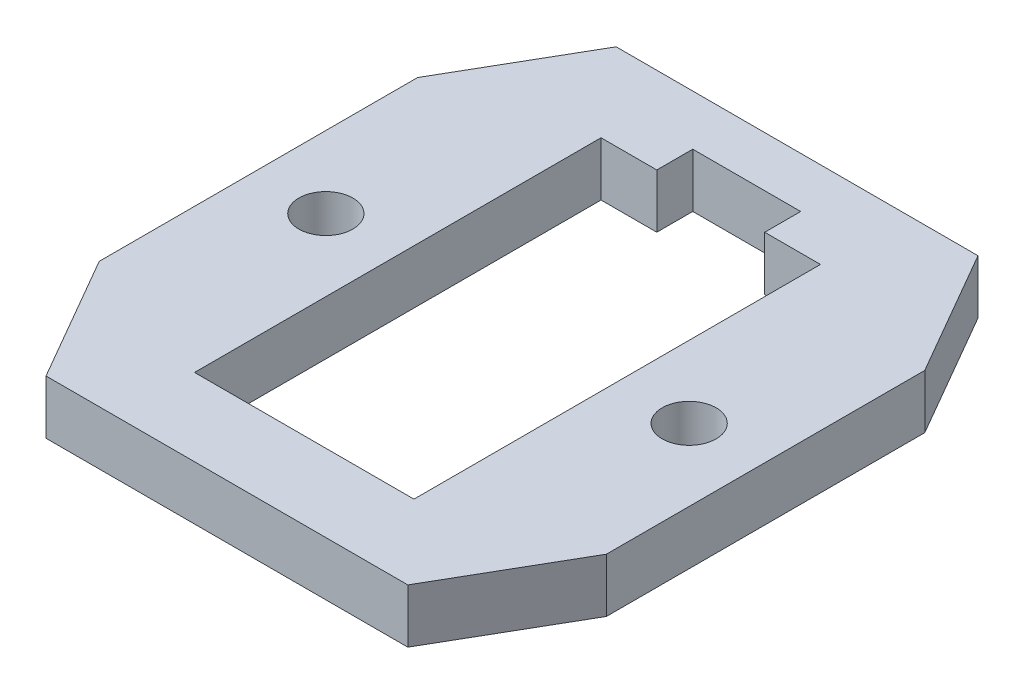
ISO-10303-21;
HEADER;
FILE_DESCRIPTION(('STEP AP214'),'2;1');
FILE_NAME('part.step','',(''),(''),'','','');
FILE_SCHEMA(('AUTOMOTIVE_DESIGN { 1 0 10303 214 1 1 1 1 }'));
ENDSEC;
DATA;
#1=APPLICATION_CONTEXT('core data for automotive mechanical design processes');
#2=APPLICATION_PROTOCOL_DEFINITION('international standard','automotive_design',2000,#1);
#3=PRODUCT_CONTEXT('',#1,'mechanical');
#4=PRODUCT('Part','Part','',(#3));
#5=PRODUCT_RELATED_PRODUCT_CATEGORY('part','',(#4));
#6=PRODUCT_DEFINITION_FORMATION('','',#4);
#7=PRODUCT_DEFINITION_CONTEXT('part definition',#1,'design');
#8=PRODUCT_DEFINITION('design','',#6,#7);
#9=PRODUCT_DEFINITION_SHAPE('','',#8);
#10=(LENGTH_UNIT() NAMED_UNIT(*) SI_UNIT(.MILLI.,.METRE.));
#11=(NAMED_UNIT(*) PLANE_ANGLE_UNIT() SI_UNIT($,.RADIAN.));
#12=(NAMED_UNIT(*) SI_UNIT($,.STERADIAN.) SOLID_ANGLE_UNIT());
#13=UNCERTAINTY_MEASURE_WITH_UNIT(LENGTH_MEASURE(1.E-05),#10,'distance_accuracy_value','');
#14=(GEOMETRIC_REPRESENTATION_CONTEXT(3) GLOBAL_UNCERTAINTY_ASSIGNED_CONTEXT((#13)) GLOBAL_UNIT_ASSIGNED_CONTEXT((#10,
#11,#12)) REPRESENTATION_CONTEXT('',''));
#15=CARTESIAN_POINT('',(0.,0.,0.));
#16=DIRECTION('',(0.,0.,1.));
#17=DIRECTION('',(1.,0.,0.));
#18=AXIS2_PLACEMENT_3D('',#15,#16,#17);
#19=CARTESIAN_POINT('',(0.,3.,0.));
#20=DIRECTION('',(0.,-1.,0.));
#21=DIRECTION('',(0.,0.,-1.));
#22=AXIS2_PLACEMENT_3D('',#19,#20,#21);
#23=PLANE('',#22);
#24=CARTESIAN_POINT('',(-10.1,3.,0.));
#25=DIRECTION('',(0.,1.,0.));
#26=DIRECTION('',(0.,0.,-1.));
#27=AXIS2_PLACEMENT_3D('',#24,#25,#26);
#28=CIRCLE('',#27,1.5);
#29=CARTESIAN_POINT('',(-10.1,3.,-1.5));
#30=VERTEX_POINT('',#29);
#31=EDGE_CURVE('E337',#30,#30,#28,.T.);
#32=ORIENTED_EDGE('',*,*,#31,.F.);
#33=EDGE_LOOP('',(#32));
#34=FACE_BOUND('',#33,.T.);
#35=CARTESIAN_POINT('',(10.1,3.,0.));
#36=DIRECTION('',(0.,1.,0.));
#37=DIRECTION('',(0.,0.,1.));
#38=AXIS2_PLACEMENT_3D('',#35,#36,#37);
#39=CIRCLE('',#38,1.5);
#40=CARTESIAN_POINT('',(10.1,3.,1.5));
#41=VERTEX_POINT('',#40);
#42=EDGE_CURVE('E206',#41,#41,#39,.T.);
#43=ORIENTED_EDGE('',*,*,#42,.F.);
#44=EDGE_LOOP('',(#43));
#45=FACE_BOUND('',#44,.T.);
#46=DIRECTION('',(-1.,0.,0.));
#47=VECTOR('',#46,1.);
#48=CARTESIAN_POINT('',(3.,3.,-11.3));
#49=LINE('',#48,#47);
#50=CARTESIAN_POINT('',(6.1,3.,-11.3));
#51=VERTEX_POINT('',#50);
#52=CARTESIAN_POINT('',(3.,3.,-11.3));
#53=VERTEX_POINT('',#52);
#54=EDGE_CURVE('E155',#51,#53,#49,.T.);
#55=ORIENTED_EDGE('',*,*,#54,.F.);
#56=DIRECTION('',(0.,0.,-1.));
#57=VECTOR('',#56,1.);
#58=CARTESIAN_POINT('',(6.1,3.,11.3));
#59=LINE('',#58,#57);
#60=CARTESIAN_POINT('',(6.1,3.,11.3));
#61=VERTEX_POINT('',#60);
#62=EDGE_CURVE('E200',#61,#51,#59,.T.);
#63=ORIENTED_EDGE('',*,*,#62,.F.);
#64=DIRECTION('',(1.,0.,0.));
#65=VECTOR('',#64,1.);
#66=CARTESIAN_POINT('',(-6.1,3.,11.3));
#67=LINE('',#66,#65);
#68=CARTESIAN_POINT('',(-6.1,3.,11.3));
#69=VERTEX_POINT('',#68);
#70=EDGE_CURVE('E196',#69,#61,#67,.T.);
#71=ORIENTED_EDGE('',*,*,#70,.F.);
#72=DIRECTION('',(0.,0.,1.));
#73=VECTOR('',#72,1.);
#74=CARTESIAN_POINT('',(-6.1,3.,11.3));
#75=LINE('',#74,#73);
#76=CARTESIAN_POINT('',(-6.1,3.,-11.3));
#77=VERTEX_POINT('',#76);
#78=EDGE_CURVE('E193',#77,#69,#75,.T.);
#79=ORIENTED_EDGE('',*,*,#78,.F.);
#80=DIRECTION('',(-1.,0.,0.));
#81=VECTOR('',#80,1.);
#82=CARTESIAN_POINT('',(-6.1,3.,-11.3));
#83=LINE('',#82,#81);
#84=CARTESIAN_POINT('',(-3.,3.,-11.3));
#85=VERTEX_POINT('',#84);
#86=EDGE_CURVE('E190',#85,#77,#83,.T.);
#87=ORIENTED_EDGE('',*,*,#86,.F.);
#88=DIRECTION('',(0.,0.,1.));
#89=VECTOR('',#88,1.);
#90=CARTESIAN_POINT('',(-3.,3.,-11.3));
#91=LINE('',#90,#89);
#92=CARTESIAN_POINT('',(-3.,3.,-13.3));
#93=VERTEX_POINT('',#92);
#94=EDGE_CURVE('E184',#93,#85,#91,.T.);
#95=ORIENTED_EDGE('',*,*,#94,.F.);
#96=DIRECTION('',(-1.,0.,0.));
#97=VECTOR('',#96,1.);
#98=CARTESIAN_POINT('',(-3.,3.,-13.3));
#99=LINE('',#98,#97);
#100=CARTESIAN_POINT('',(3.,3.,-13.3));
#101=VERTEX_POINT('',#100);
#102=EDGE_CURVE('E180',#101,#93,#99,.T.);
#103=ORIENTED_EDGE('',*,*,#102,.F.);
#104=DIRECTION('',(0.,0.,-1.));
#105=VECTOR('',#104,1.);
#106=CARTESIAN_POINT('',(3.,3.,-11.3));
#107=LINE('',#106,#105);
#108=EDGE_CURVE('E166',#53,#101,#107,.T.);
#109=ORIENTED_EDGE('',*,*,#108,.F.);
#110=EDGE_LOOP('',(#55,#63,#71,#79,#87,#95,#103,#109));
#111=FACE_BOUND('',#110,.T.);
#112=DIRECTION('',(-1.,0.,0.));
#113=VECTOR('',#112,1.);
#114=CARTESIAN_POINT('',(14.1,3.,15.6));
#115=LINE('',#114,#113);
#116=CARTESIAN_POINT('',(10.0585481156726,3.,15.6));
#117=VERTEX_POINT('',#116);
#118=CARTESIAN_POINT('',(-10.0585481156726,3.,15.6));
#119=VERTEX_POINT('',#118);
#120=EDGE_CURVE('E324',#117,#119,#115,.T.);
#121=ORIENTED_EDGE('',*,*,#120,.F.);
#122=DIRECTION('',(0.499999999999998,0.,-0.86602540378444));
#123=VECTOR('',#122,1.);
#124=CARTESIAN_POINT('',(10.0585481156726,3.,15.6));
#125=LINE('',#124,#123);
#126=CARTESIAN_POINT('',(14.1,3.,8.59999999999997));
#127=VERTEX_POINT('',#126);
#128=EDGE_CURVE('E65',#117,#127,#125,.T.);
#129=ORIENTED_EDGE('',*,*,#128,.T.);
#130=DIRECTION('',(0.,0.,-1.));
#131=VECTOR('',#130,1.);
#132=CARTESIAN_POINT('',(14.1,3.,16.1));
#133=LINE('',#132,#131);
#134=CARTESIAN_POINT('',(14.1,3.,-9.09999999999997));
#135=VERTEX_POINT('',#134);
#136=EDGE_CURVE('E251',#127,#135,#133,.T.);
#137=ORIENTED_EDGE('',*,*,#136,.T.);
#138=DIRECTION('',(0.499999999999999,0.,0.86602540378444));
#139=VECTOR('',#138,1.);
#140=CARTESIAN_POINT('',(10.0585481156726,3.,-16.1));
#141=LINE('',#140,#139);
#142=CARTESIAN_POINT('',(10.0585481156726,3.,-16.1));
#143=VERTEX_POINT('',#142);
#144=EDGE_CURVE('E284',#135,#143,#141,.F.);
#145=ORIENTED_EDGE('',*,*,#144,.T.);
#146=DIRECTION('',(-1.,0.,0.));
#147=VECTOR('',#146,1.);
#148=CARTESIAN_POINT('',(-14.1,3.,-16.1));
#149=LINE('',#148,#147);
#150=CARTESIAN_POINT('',(-10.0585481156726,3.,-16.1));
#151=VERTEX_POINT('',#150);
#152=EDGE_CURVE('E254',#143,#151,#149,.T.);
#153=ORIENTED_EDGE('',*,*,#152,.T.);
#154=DIRECTION('',(0.499999999999998,0.,-0.86602540378444));
#155=VECTOR('',#154,1.);
#156=CARTESIAN_POINT('',(-14.1,3.,-9.09999999999997));
#157=LINE('',#156,#155);
#158=CARTESIAN_POINT('',(-14.1,3.,-9.09999999999997));
#159=VERTEX_POINT('',#158);
#160=EDGE_CURVE('E297',#151,#159,#157,.F.);
#161=ORIENTED_EDGE('',*,*,#160,.T.);
#162=DIRECTION('',(0.,0.,1.));
#163=VECTOR('',#162,1.);
#164=CARTESIAN_POINT('',(-14.1,3.,16.1));
#165=LINE('',#164,#163);
#166=CARTESIAN_POINT('',(-14.1,3.,8.59999999999997));
#167=VERTEX_POINT('',#166);
#168=EDGE_CURVE('E259',#159,#167,#165,.T.);
#169=ORIENTED_EDGE('',*,*,#168,.T.);
#170=DIRECTION('',(0.499999999999999,0.,0.86602540378444));
#171=VECTOR('',#170,1.);
#172=CARTESIAN_POINT('',(-10.0585481156726,3.,15.6));
#173=LINE('',#172,#171);
#174=EDGE_CURVE('E310',#167,#119,#173,.T.);
#175=ORIENTED_EDGE('',*,*,#174,.T.);
#176=EDGE_LOOP('',(#121,#129,#137,#145,#153,#161,#169,#175));
#177=FACE_BOUND('',#176,.T.);
#178=ADVANCED_FACE('F41',(#34,#45,#111,#177),#23,.F.);
#179=CARTESIAN_POINT('',(0.,0.,0.));
#180=DIRECTION('',(0.,-1.,0.));
#181=DIRECTION('',(0.,0.,-1.));
#182=AXIS2_PLACEMENT_3D('',#179,#180,#181);
#183=PLANE('',#182);
#184=CARTESIAN_POINT('',(10.1,0.,0.));
#185=DIRECTION('',(0.,1.,0.));
#186=DIRECTION('',(0.,0.,1.));
#187=AXIS2_PLACEMENT_3D('',#184,#185,#186);
#188=CIRCLE('',#187,1.5);
#189=CARTESIAN_POINT('',(10.1,0.,1.5));
#190=VERTEX_POINT('',#189);
#191=EDGE_CURVE('E343',#190,#190,#188,.T.);
#192=ORIENTED_EDGE('',*,*,#191,.T.);
#193=EDGE_LOOP('',(#192));
#194=FACE_BOUND('',#193,.T.);
#195=DIRECTION('',(0.,0.,-1.));
#196=VECTOR('',#195,1.);
#197=CARTESIAN_POINT('',(6.1,0.,11.3));
#198=LINE('',#197,#196);
#199=CARTESIAN_POINT('',(6.1,0.,11.3));
#200=VERTEX_POINT('',#199);
#201=CARTESIAN_POINT('',(6.1,0.,-11.3));
#202=VERTEX_POINT('',#201);
#203=EDGE_CURVE('E167',#200,#202,#198,.T.);
#204=ORIENTED_EDGE('',*,*,#203,.T.);
#205=DIRECTION('',(-1.,0.,0.));
#206=VECTOR('',#205,1.);
#207=CARTESIAN_POINT('',(3.,0.,-11.3));
#208=LINE('',#207,#206);
#209=CARTESIAN_POINT('',(3.,0.,-11.3));
#210=VERTEX_POINT('',#209);
#211=EDGE_CURVE('E203',#202,#210,#208,.T.);
#212=ORIENTED_EDGE('',*,*,#211,.T.);
#213=DIRECTION('',(0.,0.,-1.));
#214=VECTOR('',#213,1.);
#215=CARTESIAN_POINT('',(3.,0.,-11.3));
#216=LINE('',#215,#214);
#217=CARTESIAN_POINT('',(3.,0.,-13.3));
#218=VERTEX_POINT('',#217);
#219=EDGE_CURVE('E173',#210,#218,#216,.T.);
#220=ORIENTED_EDGE('',*,*,#219,.T.);
#221=DIRECTION('',(-1.,0.,0.));
#222=VECTOR('',#221,1.);
#223=CARTESIAN_POINT('',(-3.,0.,-13.3));
#224=LINE('',#223,#222);
#225=CARTESIAN_POINT('',(-3.,0.,-13.3));
#226=VERTEX_POINT('',#225);
#227=EDGE_CURVE('E209',#218,#226,#224,.T.);
#228=ORIENTED_EDGE('',*,*,#227,.T.);
#229=DIRECTION('',(0.,0.,1.));
#230=VECTOR('',#229,1.);
#231=CARTESIAN_POINT('',(-3.,0.,-11.3));
#232=LINE('',#231,#230);
#233=CARTESIAN_POINT('',(-3.,0.,-11.3));
#234=VERTEX_POINT('',#233);
#235=EDGE_CURVE('E213',#226,#234,#232,.T.);
#236=ORIENTED_EDGE('',*,*,#235,.T.);
#237=DIRECTION('',(-1.,0.,0.));
#238=VECTOR('',#237,1.);
#239=CARTESIAN_POINT('',(-6.1,0.,-11.3));
#240=LINE('',#239,#238);
#241=CARTESIAN_POINT('',(-6.1,0.,-11.3));
#242=VERTEX_POINT('',#241);
#243=EDGE_CURVE('E217',#234,#242,#240,.T.);
#244=ORIENTED_EDGE('',*,*,#243,.T.);
#245=DIRECTION('',(0.,0.,1.));
#246=VECTOR('',#245,1.);
#247=CARTESIAN_POINT('',(-6.1,0.,11.3));
#248=LINE('',#247,#246);
#249=CARTESIAN_POINT('',(-6.1,0.,11.3));
#250=VERTEX_POINT('',#249);
#251=EDGE_CURVE('E221',#242,#250,#248,.T.);
#252=ORIENTED_EDGE('',*,*,#251,.T.);
#253=DIRECTION('',(1.,0.,0.));
#254=VECTOR('',#253,1.);
#255=CARTESIAN_POINT('',(-6.1,0.,11.3));
#256=LINE('',#255,#254);
#257=EDGE_CURVE('E225',#250,#200,#256,.T.);
#258=ORIENTED_EDGE('',*,*,#257,.T.);
#259=EDGE_LOOP('',(#204,#212,#220,#228,#236,#244,#252,#258));
#260=FACE_BOUND('',#259,.T.);
#261=CARTESIAN_POINT('',(-10.1,0.,0.));
#262=DIRECTION('',(0.,1.,0.));
#263=DIRECTION('',(0.,0.,-1.));
#264=AXIS2_PLACEMENT_3D('',#261,#262,#263);
#265=CIRCLE('',#264,1.5);
#266=CARTESIAN_POINT('',(-10.1,0.,-1.5));
#267=VERTEX_POINT('',#266);
#268=EDGE_CURVE('E332',#267,#267,#265,.T.);
#269=ORIENTED_EDGE('',*,*,#268,.T.);
#270=EDGE_LOOP('',(#269));
#271=FACE_BOUND('',#270,.T.);
#272=DIRECTION('',(0.,0.,-1.));
#273=VECTOR('',#272,1.);
#274=CARTESIAN_POINT('',(14.1,0.,16.1));
#275=LINE('',#274,#273);
#276=CARTESIAN_POINT('',(14.1,0.,8.59999999999997));
#277=VERTEX_POINT('',#276);
#278=CARTESIAN_POINT('',(14.1,0.,-9.09999999999997));
#279=VERTEX_POINT('',#278);
#280=EDGE_CURVE('E175',#277,#279,#275,.T.);
#281=ORIENTED_EDGE('',*,*,#280,.F.);
#282=DIRECTION('',(-0.499999999999998,0.,0.86602540378444));
#283=VECTOR('',#282,1.);
#284=CARTESIAN_POINT('',(14.2989092362731,0.,8.25547909668026));
#285=LINE('',#284,#283);
#286=CARTESIAN_POINT('',(10.0585481156726,0.,15.6));
#287=VERTEX_POINT('',#286);
#288=EDGE_CURVE('E11',#277,#287,#285,.T.);
#289=ORIENTED_EDGE('',*,*,#288,.T.);
#290=DIRECTION('',(1.,0.,0.));
#291=VECTOR('',#290,1.);
#292=CARTESIAN_POINT('',(-14.1,0.,15.6));
#293=LINE('',#292,#291);
#294=CARTESIAN_POINT('',(-10.0585481156726,0.,15.6));
#295=VERTEX_POINT('',#294);
#296=EDGE_CURVE('E326',#295,#287,#293,.T.);
#297=ORIENTED_EDGE('',*,*,#296,.F.);
#298=DIRECTION('',(-0.499999999999999,0.,-0.86602540378444));
#299=VECTOR('',#298,1.);
#300=CARTESIAN_POINT('',(-14.2989092362731,0.,8.25547909668026));
#301=LINE('',#300,#299);
#302=CARTESIAN_POINT('',(-14.1,0.,8.59999999999997));
#303=VERTEX_POINT('',#302);
#304=EDGE_CURVE('E304',#295,#303,#301,.T.);
#305=ORIENTED_EDGE('',*,*,#304,.T.);
#306=DIRECTION('',(0.,0.,1.));
#307=VECTOR('',#306,1.);
#308=CARTESIAN_POINT('',(-14.1,0.,16.1));
#309=LINE('',#308,#307);
#310=CARTESIAN_POINT('',(-14.1,0.,-9.09999999999997));
#311=VERTEX_POINT('',#310);
#312=EDGE_CURVE('E255',#311,#303,#309,.T.);
#313=ORIENTED_EDGE('',*,*,#312,.F.);
#314=DIRECTION('',(-0.499999999999998,0.,0.86602540378444));
#315=VECTOR('',#314,1.);
#316=CARTESIAN_POINT('',(-14.5154155872192,0.,-8.38047909668025));
#317=LINE('',#316,#315);
#318=CARTESIAN_POINT('',(-10.0585481156726,0.,-16.1));
#319=VERTEX_POINT('',#318);
#320=EDGE_CURVE('E291',#311,#319,#317,.F.);
#321=ORIENTED_EDGE('',*,*,#320,.T.);
#322=DIRECTION('',(-1.,0.,0.));
#323=VECTOR('',#322,1.);
#324=CARTESIAN_POINT('',(-14.1,0.,-16.1));
#325=LINE('',#324,#323);
#326=CARTESIAN_POINT('',(10.0585481156726,0.,-16.1));
#327=VERTEX_POINT('',#326);
#328=EDGE_CURVE('E266',#327,#319,#325,.T.);
#329=ORIENTED_EDGE('',*,*,#328,.F.);
#330=DIRECTION('',(-0.499999999999999,0.,-0.86602540378444));
#331=VECTOR('',#330,1.);
#332=CARTESIAN_POINT('',(14.5154155872192,0.,-8.38047909668026));
#333=LINE('',#332,#331);
#334=EDGE_CURVE('E276',#327,#279,#333,.F.);
#335=ORIENTED_EDGE('',*,*,#334,.T.);
#336=EDGE_LOOP('',(#281,#289,#297,#305,#313,#321,#329,#335));
#337=FACE_BOUND('',#336,.T.);
#338=ADVANCED_FACE('F351',(#194,#260,#271,#337),#183,.T.);
#339=CARTESIAN_POINT('',(14.1,3.,16.1));
#340=DIRECTION('',(-1.,0.,0.));
#341=DIRECTION('',(0.,0.,1.));
#342=AXIS2_PLACEMENT_3D('',#339,#340,#341);
#343=PLANE('',#342);
#344=ORIENTED_EDGE('',*,*,#136,.F.);
#345=DIRECTION('',(0.,-1.,0.));
#346=VECTOR('',#345,1.);
#347=CARTESIAN_POINT('',(14.1,0.,8.59999999999997));
#348=LINE('',#347,#346);
#349=EDGE_CURVE('E51',#127,#277,#348,.T.);
#350=ORIENTED_EDGE('',*,*,#349,.T.);
#351=ORIENTED_EDGE('',*,*,#280,.T.);
#352=DIRECTION('',(0.,1.,0.));
#353=VECTOR('',#352,1.);
#354=CARTESIAN_POINT('',(14.1,3.,-9.09999999999997));
#355=LINE('',#354,#353);
#356=EDGE_CURVE('E280',#279,#135,#355,.T.);
#357=ORIENTED_EDGE('',*,*,#356,.T.);
#358=EDGE_LOOP('',(#344,#350,#351,#357));
#359=FACE_BOUND('',#358,.T.);
#360=ADVANCED_FACE('F376',(#359),#343,.F.);
#361=CARTESIAN_POINT('',(-14.1,3.,16.1));
#362=DIRECTION('',(1.,0.,0.));
#363=DIRECTION('',(0.,0.,-1.));
#364=AXIS2_PLACEMENT_3D('',#361,#362,#363);
#365=PLANE('',#364);
#366=ORIENTED_EDGE('',*,*,#312,.T.);
#367=DIRECTION('',(0.,1.,0.));
#368=VECTOR('',#367,1.);
#369=CARTESIAN_POINT('',(-14.1,3.,8.59999999999997));
#370=LINE('',#369,#368);
#371=EDGE_CURVE('E307',#303,#167,#370,.T.);
#372=ORIENTED_EDGE('',*,*,#371,.T.);
#373=ORIENTED_EDGE('',*,*,#168,.F.);
#374=DIRECTION('',(0.,-1.,0.));
#375=VECTOR('',#374,1.);
#376=CARTESIAN_POINT('',(-14.1,3.,-9.09999999999997));
#377=LINE('',#376,#375);
#378=EDGE_CURVE('E287',#159,#311,#377,.T.);
#379=ORIENTED_EDGE('',*,*,#378,.T.);
#380=EDGE_LOOP('',(#366,#372,#373,#379));
#381=FACE_BOUND('',#380,.T.);
#382=ADVANCED_FACE('F383',(#381),#365,.F.);
#383=CARTESIAN_POINT('',(-14.1,3.,-16.1));
#384=DIRECTION('',(0.,0.,1.));
#385=DIRECTION('',(1.,0.,0.));
#386=AXIS2_PLACEMENT_3D('',#383,#384,#385);
#387=PLANE('',#386);
#388=ORIENTED_EDGE('',*,*,#328,.T.);
#389=DIRECTION('',(0.,1.,0.));
#390=VECTOR('',#389,1.);
#391=CARTESIAN_POINT('',(-10.0585481156726,3.,-16.1));
#392=LINE('',#391,#390);
#393=EDGE_CURVE('E294',#319,#151,#392,.T.);
#394=ORIENTED_EDGE('',*,*,#393,.T.);
#395=ORIENTED_EDGE('',*,*,#152,.F.);
#396=DIRECTION('',(0.,-1.,0.));
#397=VECTOR('',#396,1.);
#398=CARTESIAN_POINT('',(10.0585481156726,3.,-16.1));
#399=LINE('',#398,#397);
#400=EDGE_CURVE('E263',#143,#327,#399,.T.);
#401=ORIENTED_EDGE('',*,*,#400,.T.);
#402=EDGE_LOOP('',(#388,#394,#395,#401));
#403=FACE_BOUND('',#402,.T.);
#404=ADVANCED_FACE('F386',(#403),#387,.F.);
#405=CARTESIAN_POINT('',(3.,3.,-11.3));
#406=DIRECTION('',(0.,0.,1.));
#407=DIRECTION('',(1.,0.,0.));
#408=AXIS2_PLACEMENT_3D('',#405,#406,#407);
#409=PLANE('',#408);
#410=ORIENTED_EDGE('',*,*,#211,.F.);
#411=DIRECTION('',(0.,-1.,0.));
#412=VECTOR('',#411,1.);
#413=CARTESIAN_POINT('',(6.1,3.,-11.3));
#414=LINE('',#413,#412);
#415=EDGE_CURVE('E161',#51,#202,#414,.T.);
#416=ORIENTED_EDGE('',*,*,#415,.F.);
#417=ORIENTED_EDGE('',*,*,#54,.T.);
#418=DIRECTION('',(0.,-1.,0.));
#419=VECTOR('',#418,1.);
#420=CARTESIAN_POINT('',(3.,3.,-11.3));
#421=LINE('',#420,#419);
#422=EDGE_CURVE('E158',#53,#210,#421,.T.);
#423=ORIENTED_EDGE('',*,*,#422,.T.);
#424=EDGE_LOOP('',(#410,#416,#417,#423));
#425=FACE_BOUND('',#424,.T.);
#426=ADVANCED_FACE('F157',(#425),#409,.T.);
#427=CARTESIAN_POINT('',(3.,3.,-11.3));
#428=DIRECTION('',(-1.,0.,0.));
#429=DIRECTION('',(0.,0.,1.));
#430=AXIS2_PLACEMENT_3D('',#427,#428,#429);
#431=PLANE('',#430);
#432=ORIENTED_EDGE('',*,*,#219,.F.);
#433=ORIENTED_EDGE('',*,*,#422,.F.);
#434=ORIENTED_EDGE('',*,*,#108,.T.);
#435=DIRECTION('',(0.,-1.,0.));
#436=VECTOR('',#435,1.);
#437=CARTESIAN_POINT('',(3.,3.,-13.3));
#438=LINE('',#437,#436);
#439=EDGE_CURVE('E176',#101,#218,#438,.T.);
#440=ORIENTED_EDGE('',*,*,#439,.T.);
#441=EDGE_LOOP('',(#432,#433,#434,#440));
#442=FACE_BOUND('',#441,.T.);
#443=ADVANCED_FACE('F170',(#442),#431,.T.);
#444=CARTESIAN_POINT('',(-3.,3.,-13.3));
#445=DIRECTION('',(0.,0.,1.));
#446=DIRECTION('',(1.,0.,0.));
#447=AXIS2_PLACEMENT_3D('',#444,#445,#446);
#448=PLANE('',#447);
#449=ORIENTED_EDGE('',*,*,#227,.F.);
#450=ORIENTED_EDGE('',*,*,#439,.F.);
#451=ORIENTED_EDGE('',*,*,#102,.T.);
#452=DIRECTION('',(0.,-1.,0.));
#453=VECTOR('',#452,1.);
#454=CARTESIAN_POINT('',(-3.,3.,-13.3));
#455=LINE('',#454,#453);
#456=EDGE_CURVE('E246',#93,#226,#455,.T.);
#457=ORIENTED_EDGE('',*,*,#456,.T.);
#458=EDGE_LOOP('',(#449,#450,#451,#457));
#459=FACE_BOUND('',#458,.T.);
#460=ADVANCED_FACE('F495',(#459),#448,.T.);
#461=CARTESIAN_POINT('',(-3.,3.,-11.3));
#462=DIRECTION('',(1.,0.,0.));
#463=DIRECTION('',(0.,0.,-1.));
#464=AXIS2_PLACEMENT_3D('',#461,#462,#463);
#465=PLANE('',#464);
#466=ORIENTED_EDGE('',*,*,#235,.F.);
#467=ORIENTED_EDGE('',*,*,#456,.F.);
#468=ORIENTED_EDGE('',*,*,#94,.T.);
#469=DIRECTION('',(0.,-1.,0.));
#470=VECTOR('',#469,1.);
#471=CARTESIAN_POINT('',(-3.,3.,-11.3));
#472=LINE('',#471,#470);
#473=EDGE_CURVE('E243',#85,#234,#472,.T.);
#474=ORIENTED_EDGE('',*,*,#473,.T.);
#475=EDGE_LOOP('',(#466,#467,#468,#474));
#476=FACE_BOUND('',#475,.T.);
#477=ADVANCED_FACE('F485',(#476),#465,.T.);
#478=CARTESIAN_POINT('',(-6.1,3.,-11.3));
#479=DIRECTION('',(0.,0.,1.));
#480=DIRECTION('',(1.,0.,0.));
#481=AXIS2_PLACEMENT_3D('',#478,#479,#480);
#482=PLANE('',#481);
#483=ORIENTED_EDGE('',*,*,#243,.F.);
#484=ORIENTED_EDGE('',*,*,#473,.F.);
#485=ORIENTED_EDGE('',*,*,#86,.T.);
#486=DIRECTION('',(0.,-1.,0.));
#487=VECTOR('',#486,1.);
#488=CARTESIAN_POINT('',(-6.1,3.,-11.3));
#489=LINE('',#488,#487);
#490=EDGE_CURVE('E240',#77,#242,#489,.T.);
#491=ORIENTED_EDGE('',*,*,#490,.T.);
#492=EDGE_LOOP('',(#483,#484,#485,#491));
#493=FACE_BOUND('',#492,.T.);
#494=ADVANCED_FACE('F475',(#493),#482,.T.);
#495=CARTESIAN_POINT('',(-6.1,3.,11.3));
#496=DIRECTION('',(1.,0.,0.));
#497=DIRECTION('',(0.,0.,-1.));
#498=AXIS2_PLACEMENT_3D('',#495,#496,#497);
#499=PLANE('',#498);
#500=ORIENTED_EDGE('',*,*,#251,.F.);
#501=ORIENTED_EDGE('',*,*,#490,.F.);
#502=ORIENTED_EDGE('',*,*,#78,.T.);
#503=DIRECTION('',(0.,-1.,0.));
#504=VECTOR('',#503,1.);
#505=CARTESIAN_POINT('',(-6.1,3.,11.3));
#506=LINE('',#505,#504);
#507=EDGE_CURVE('E237',#69,#250,#506,.T.);
#508=ORIENTED_EDGE('',*,*,#507,.T.);
#509=EDGE_LOOP('',(#500,#501,#502,#508));
#510=FACE_BOUND('',#509,.T.);
#511=ADVANCED_FACE('F465',(#510),#499,.T.);
#512=CARTESIAN_POINT('',(-6.1,3.,11.3));
#513=DIRECTION('',(0.,0.,-1.));
#514=DIRECTION('',(-1.,0.,0.));
#515=AXIS2_PLACEMENT_3D('',#512,#513,#514);
#516=PLANE('',#515);
#517=ORIENTED_EDGE('',*,*,#257,.F.);
#518=ORIENTED_EDGE('',*,*,#507,.F.);
#519=ORIENTED_EDGE('',*,*,#70,.T.);
#520=DIRECTION('',(0.,-1.,0.));
#521=VECTOR('',#520,1.);
#522=CARTESIAN_POINT('',(6.1,3.,11.3));
#523=LINE('',#522,#521);
#524=EDGE_CURVE('E234',#61,#200,#523,.T.);
#525=ORIENTED_EDGE('',*,*,#524,.T.);
#526=EDGE_LOOP('',(#517,#518,#519,#525));
#527=FACE_BOUND('',#526,.T.);
#528=ADVANCED_FACE('F367',(#527),#516,.T.);
#529=CARTESIAN_POINT('',(6.1,3.,11.3));
#530=DIRECTION('',(-1.,0.,0.));
#531=DIRECTION('',(0.,0.,1.));
#532=AXIS2_PLACEMENT_3D('',#529,#530,#531);
#533=PLANE('',#532);
#534=ORIENTED_EDGE('',*,*,#203,.F.);
#535=ORIENTED_EDGE('',*,*,#524,.F.);
#536=ORIENTED_EDGE('',*,*,#62,.T.);
#537=ORIENTED_EDGE('',*,*,#415,.T.);
#538=EDGE_LOOP('',(#534,#535,#536,#537));
#539=FACE_BOUND('',#538,.T.);
#540=ADVANCED_FACE('F357',(#539),#533,.T.);
#541=CARTESIAN_POINT('',(10.1,3.,0.));
#542=DIRECTION('',(0.,-1.,0.));
#543=DIRECTION('',(0.,0.,-1.));
#544=AXIS2_PLACEMENT_3D('',#541,#542,#543);
#545=CYLINDRICAL_SURFACE('',#544,1.5);
#546=ORIENTED_EDGE('',*,*,#42,.T.);
#547=EDGE_LOOP('',(#546));
#548=FACE_BOUND('',#547,.T.);
#549=ORIENTED_EDGE('',*,*,#191,.F.);
#550=EDGE_LOOP('',(#549));
#551=FACE_BOUND('',#550,.T.);
#552=ADVANCED_FACE('F354',(#548,#551),#545,.F.);
#553=CARTESIAN_POINT('',(-10.1,3.,0.));
#554=DIRECTION('',(0.,-1.,0.));
#555=DIRECTION('',(0.,0.,-1.));
#556=AXIS2_PLACEMENT_3D('',#553,#554,#555);
#557=CYLINDRICAL_SURFACE('',#556,1.5);
#558=ORIENTED_EDGE('',*,*,#31,.T.);
#559=EDGE_LOOP('',(#558));
#560=FACE_BOUND('',#559,.T.);
#561=ORIENTED_EDGE('',*,*,#268,.F.);
#562=EDGE_LOOP('',(#561));
#563=FACE_BOUND('',#562,.T.);
#564=ADVANCED_FACE('F356',(#560,#563),#557,.F.);
#565=CARTESIAN_POINT('',(10.0585481156726,3.,-16.1));
#566=DIRECTION('',(-0.866025403784439,0.,0.499999999999998));
#567=DIRECTION('',(0.,-1.,0.));
#568=AXIS2_PLACEMENT_3D('',#565,#566,#567);
#569=PLANE('',#568);
#570=ORIENTED_EDGE('',*,*,#144,.F.);
#571=ORIENTED_EDGE('',*,*,#356,.F.);
#572=ORIENTED_EDGE('',*,*,#334,.F.);
#573=ORIENTED_EDGE('',*,*,#400,.F.);
#574=EDGE_LOOP('',(#570,#571,#572,#573));
#575=FACE_BOUND('',#574,.T.);
#576=ADVANCED_FACE('F364',(#575),#569,.F.);
#577=CARTESIAN_POINT('',(-14.1,3.,-9.09999999999997));
#578=DIRECTION('',(0.86602540378444,0.,0.499999999999998));
#579=DIRECTION('',(0.,-1.,0.));
#580=AXIS2_PLACEMENT_3D('',#577,#578,#579);
#581=PLANE('',#580);
#582=ORIENTED_EDGE('',*,*,#160,.F.);
#583=ORIENTED_EDGE('',*,*,#393,.F.);
#584=ORIENTED_EDGE('',*,*,#320,.F.);
#585=ORIENTED_EDGE('',*,*,#378,.F.);
#586=EDGE_LOOP('',(#582,#583,#584,#585));
#587=FACE_BOUND('',#586,.T.);
#588=ADVANCED_FACE('F399',(#587),#581,.F.);
#589=CARTESIAN_POINT('',(0.,0.,15.6));
#590=DIRECTION('',(0.,0.,1.));
#591=DIRECTION('',(1.,0.,0.));
#592=AXIS2_PLACEMENT_3D('',#589,#590,#591);
#593=PLANE('',#592);
#594=ORIENTED_EDGE('',*,*,#296,.T.);
#595=DIRECTION('',(0.,1.,0.));
#596=VECTOR('',#595,1.);
#597=CARTESIAN_POINT('',(10.0585481156726,3.,15.6));
#598=LINE('',#597,#596);
#599=EDGE_CURVE('E314',#287,#117,#598,.T.);
#600=ORIENTED_EDGE('',*,*,#599,.T.);
#601=ORIENTED_EDGE('',*,*,#120,.T.);
#602=DIRECTION('',(0.,-1.,0.));
#603=VECTOR('',#602,1.);
#604=CARTESIAN_POINT('',(-10.0585481156726,0.,15.6));
#605=LINE('',#604,#603);
#606=EDGE_CURVE('E300',#119,#295,#605,.T.);
#607=ORIENTED_EDGE('',*,*,#606,.T.);
#608=EDGE_LOOP('',(#594,#600,#601,#607));
#609=FACE_BOUND('',#608,.T.);
#610=ADVANCED_FACE('F323',(#609),#593,.T.);
#611=CARTESIAN_POINT('',(-10.0585481156726,0.,15.6));
#612=DIRECTION('',(-0.866025403784439,0.,0.499999999999998));
#613=DIRECTION('',(0.,1.,0.));
#614=AXIS2_PLACEMENT_3D('',#611,#612,#613);
#615=PLANE('',#614);
#616=ORIENTED_EDGE('',*,*,#174,.F.);
#617=ORIENTED_EDGE('',*,*,#371,.F.);
#618=ORIENTED_EDGE('',*,*,#304,.F.);
#619=ORIENTED_EDGE('',*,*,#606,.F.);
#620=EDGE_LOOP('',(#616,#617,#618,#619));
#621=FACE_BOUND('',#620,.T.);
#622=ADVANCED_FACE('F406',(#621),#615,.T.);
#623=CARTESIAN_POINT('',(10.0585481156726,0.,15.6));
#624=DIRECTION('',(0.86602540378444,0.,0.499999999999998));
#625=DIRECTION('',(0.,-1.,0.));
#626=AXIS2_PLACEMENT_3D('',#623,#624,#625);
#627=PLANE('',#626);
#628=ORIENTED_EDGE('',*,*,#288,.F.);
#629=ORIENTED_EDGE('',*,*,#349,.F.);
#630=ORIENTED_EDGE('',*,*,#128,.F.);
#631=ORIENTED_EDGE('',*,*,#599,.F.);
#632=EDGE_LOOP('',(#628,#629,#630,#631));
#633=FACE_BOUND('',#632,.T.);
#634=ADVANCED_FACE('F44',(#633),#627,.T.);
#635=CLOSED_SHELL('',(#178,#338,#360,#382,#404,#426,#443,#460,#477,#494,#511,#528,#540,#552,
#564,#576,#588,#610,#622,#634));
#636=MANIFOLD_SOLID_BREP('B2',#635);
#637=ADVANCED_BREP_SHAPE_REPRESENTATION('',(#18,#636),#14);
#638=SHAPE_DEFINITION_REPRESENTATION(#9,#637);
ENDSEC;
END-ISO-10303-21;
